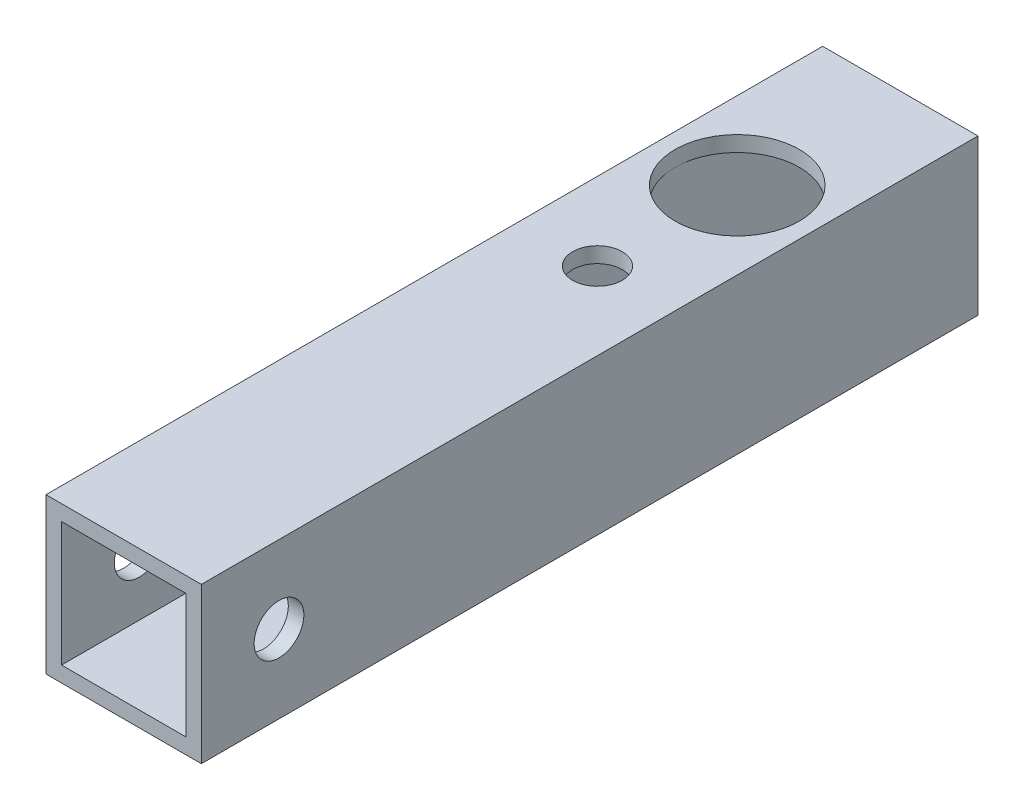
ISO-10303-21;
HEADER;
FILE_DESCRIPTION(('STEP AP214'),'2;1');
FILE_NAME('part.step','',(''),(''),'','','');
FILE_SCHEMA(('AUTOMOTIVE_DESIGN { 1 0 10303 214 1 1 1 1 }'));
ENDSEC;
DATA;
#1=APPLICATION_CONTEXT('core data for automotive mechanical design processes');
#2=APPLICATION_PROTOCOL_DEFINITION('international standard','automotive_design',2000,#1);
#3=PRODUCT_CONTEXT('',#1,'mechanical');
#4=PRODUCT('Part','Part','',(#3));
#5=PRODUCT_RELATED_PRODUCT_CATEGORY('part','',(#4));
#6=PRODUCT_DEFINITION_FORMATION('','',#4);
#7=PRODUCT_DEFINITION_CONTEXT('part definition',#1,'design');
#8=PRODUCT_DEFINITION('design','',#6,#7);
#9=PRODUCT_DEFINITION_SHAPE('','',#8);
#10=(LENGTH_UNIT() NAMED_UNIT(*) SI_UNIT(.MILLI.,.METRE.));
#11=(NAMED_UNIT(*) PLANE_ANGLE_UNIT() SI_UNIT($,.RADIAN.));
#12=(NAMED_UNIT(*) SI_UNIT($,.STERADIAN.) SOLID_ANGLE_UNIT());
#13=UNCERTAINTY_MEASURE_WITH_UNIT(LENGTH_MEASURE(1.E-05),#10,'distance_accuracy_value','');
#14=(GEOMETRIC_REPRESENTATION_CONTEXT(3) GLOBAL_UNCERTAINTY_ASSIGNED_CONTEXT((#13)) GLOBAL_UNIT_ASSIGNED_CONTEXT((#10,
#11,#12)) REPRESENTATION_CONTEXT('',''));
#15=CARTESIAN_POINT('',(0.,0.,0.));
#16=DIRECTION('',(0.,0.,1.));
#17=DIRECTION('',(1.,0.,0.));
#18=AXIS2_PLACEMENT_3D('',#15,#16,#17);
#19=CARTESIAN_POINT('',(0.,1.,50.));
#20=DIRECTION('',(0.,1.,0.));
#21=DIRECTION('',(0.,0.,1.));
#22=AXIS2_PLACEMENT_3D('',#19,#20,#21);
#23=PLANE('',#22);
#24=CARTESIAN_POINT('',(5.,1.,10.5));
#25=DIRECTION('',(0.,1.,0.));
#26=DIRECTION('',(0.,0.,1.));
#27=AXIS2_PLACEMENT_3D('',#24,#25,#26);
#28=CIRCLE('',#27,4.);
#29=CARTESIAN_POINT('',(9.,1.,10.5));
#30=VERTEX_POINT('',#29);
#31=CARTESIAN_POINT('',(1.,1.,10.5));
#32=VERTEX_POINT('',#31);
#33=EDGE_CURVE('E73',#30,#32,#28,.T.);
#34=ORIENTED_EDGE('',*,*,#33,.F.);
#35=DIRECTION('',(0.,0.,-1.));
#36=VECTOR('',#35,1.);
#37=CARTESIAN_POINT('',(9.,1.,50.));
#38=LINE('',#37,#36);
#39=CARTESIAN_POINT('',(9.,1.,0.));
#40=VERTEX_POINT('',#39);
#41=EDGE_CURVE('E160',#30,#40,#38,.T.);
#42=ORIENTED_EDGE('',*,*,#41,.T.);
#43=DIRECTION('',(1.,0.,0.));
#44=VECTOR('',#43,1.);
#45=CARTESIAN_POINT('',(0.,1.,0.));
#46=LINE('',#45,#44);
#47=CARTESIAN_POINT('',(1.,1.,0.));
#48=VERTEX_POINT('',#47);
#49=EDGE_CURVE('E233',#48,#40,#46,.T.);
#50=ORIENTED_EDGE('',*,*,#49,.F.);
#51=DIRECTION('',(0.,0.,-1.));
#52=VECTOR('',#51,1.);
#53=CARTESIAN_POINT('',(1.,1.,50.));
#54=LINE('',#53,#52);
#55=EDGE_CURVE('E167',#32,#48,#54,.T.);
#56=ORIENTED_EDGE('',*,*,#55,.F.);
#57=EDGE_LOOP('',(#34,#42,#50,#56));
#58=FACE_BOUND('',#57,.T.);
#59=ADVANCED_FACE('F58',(#58),#23,.T.);
#60=CARTESIAN_POINT('',(0.,9.,50.));
#61=DIRECTION('',(0.,-1.,0.));
#62=DIRECTION('',(0.,0.,-1.));
#63=AXIS2_PLACEMENT_3D('',#60,#61,#62);
#64=PLANE('',#63);
#65=CARTESIAN_POINT('',(5.,9.,10.5));
#66=DIRECTION('',(0.,-1.,0.));
#67=DIRECTION('',(0.,0.,-1.));
#68=AXIS2_PLACEMENT_3D('',#65,#66,#67);
#69=CIRCLE('',#68,4.);
#70=CARTESIAN_POINT('',(9.,9.,10.5));
#71=VERTEX_POINT('',#70);
#72=CARTESIAN_POINT('',(1.,9.,10.5));
#73=VERTEX_POINT('',#72);
#74=EDGE_CURVE('E12',#71,#73,#69,.T.);
#75=ORIENTED_EDGE('',*,*,#74,.F.);
#76=DIRECTION('',(0.,0.,-1.));
#77=VECTOR('',#76,1.);
#78=CARTESIAN_POINT('',(9.,9.,50.));
#79=LINE('',#78,#77);
#80=CARTESIAN_POINT('',(9.,9.,50.));
#81=VERTEX_POINT('',#80);
#82=EDGE_CURVE('E142',#81,#71,#79,.T.);
#83=ORIENTED_EDGE('',*,*,#82,.F.);
#84=DIRECTION('',(-1.,0.,0.));
#85=VECTOR('',#84,1.);
#86=CARTESIAN_POINT('',(0.,9.,50.));
#87=LINE('',#86,#85);
#88=CARTESIAN_POINT('',(1.,9.,50.));
#89=VERTEX_POINT('',#88);
#90=EDGE_CURVE('E227',#81,#89,#87,.T.);
#91=ORIENTED_EDGE('',*,*,#90,.T.);
#92=DIRECTION('',(0.,0.,-1.));
#93=VECTOR('',#92,1.);
#94=CARTESIAN_POINT('',(1.,9.,50.));
#95=LINE('',#94,#93);
#96=EDGE_CURVE('E145',#89,#73,#95,.T.);
#97=ORIENTED_EDGE('',*,*,#96,.T.);
#98=EDGE_LOOP('',(#75,#83,#91,#97));
#99=FACE_BOUND('',#98,.T.);
#100=CARTESIAN_POINT('',(5.,9.,19.5));
#101=DIRECTION('',(0.,-1.,0.));
#102=DIRECTION('',(0.,0.,-1.));
#103=AXIS2_PLACEMENT_3D('',#100,#101,#102);
#104=CIRCLE('',#103,1.6);
#105=CARTESIAN_POINT('',(5.,9.,17.9));
#106=VERTEX_POINT('',#105);
#107=EDGE_CURVE('E200',#106,#106,#104,.T.);
#108=ORIENTED_EDGE('',*,*,#107,.F.);
#109=EDGE_LOOP('',(#108));
#110=FACE_BOUND('',#109,.T.);
#111=ADVANCED_FACE('F139',(#99,#110),#64,.T.);
#112=CARTESIAN_POINT('',(0.,0.,50.));
#113=DIRECTION('',(0.,0.,1.));
#114=DIRECTION('',(1.,0.,0.));
#115=AXIS2_PLACEMENT_3D('',#112,#113,#114);
#116=PLANE('',#115);
#117=DIRECTION('',(0.,-1.,0.));
#118=VECTOR('',#117,1.);
#119=CARTESIAN_POINT('',(0.,0.,50.));
#120=LINE('',#119,#118);
#121=CARTESIAN_POINT('',(0.,10.,50.));
#122=VERTEX_POINT('',#121);
#123=CARTESIAN_POINT('',(0.,0.,50.));
#124=VERTEX_POINT('',#123);
#125=EDGE_CURVE('E172',#122,#124,#120,.T.);
#126=ORIENTED_EDGE('',*,*,#125,.T.);
#127=DIRECTION('',(1.,0.,0.));
#128=VECTOR('',#127,1.);
#129=CARTESIAN_POINT('',(0.,0.,50.));
#130=LINE('',#129,#128);
#131=CARTESIAN_POINT('',(10.,0.,50.));
#132=VERTEX_POINT('',#131);
#133=EDGE_CURVE('E175',#124,#132,#130,.T.);
#134=ORIENTED_EDGE('',*,*,#133,.T.);
#135=DIRECTION('',(0.,1.,0.));
#136=VECTOR('',#135,1.);
#137=CARTESIAN_POINT('',(10.,0.,50.));
#138=LINE('',#137,#136);
#139=CARTESIAN_POINT('',(10.,10.,50.));
#140=VERTEX_POINT('',#139);
#141=EDGE_CURVE('E178',#132,#140,#138,.T.);
#142=ORIENTED_EDGE('',*,*,#141,.T.);
#143=DIRECTION('',(-1.,0.,0.));
#144=VECTOR('',#143,1.);
#145=CARTESIAN_POINT('',(0.,10.,50.));
#146=LINE('',#145,#144);
#147=EDGE_CURVE('E180',#140,#122,#146,.T.);
#148=ORIENTED_EDGE('',*,*,#147,.T.);
#149=EDGE_LOOP('',(#126,#134,#142,#148));
#150=FACE_BOUND('',#149,.T.);
#151=DIRECTION('',(1.,0.,0.));
#152=VECTOR('',#151,1.);
#153=CARTESIAN_POINT('',(0.,1.,50.));
#154=LINE('',#153,#152);
#155=CARTESIAN_POINT('',(1.,1.,50.));
#156=VERTEX_POINT('',#155);
#157=CARTESIAN_POINT('',(9.,1.,50.));
#158=VERTEX_POINT('',#157);
#159=EDGE_CURVE('E224',#156,#158,#154,.T.);
#160=ORIENTED_EDGE('',*,*,#159,.F.);
#161=DIRECTION('',(0.,-1.,0.));
#162=VECTOR('',#161,1.);
#163=CARTESIAN_POINT('',(1.,0.,50.));
#164=LINE('',#163,#162);
#165=EDGE_CURVE('E222',#89,#156,#164,.T.);
#166=ORIENTED_EDGE('',*,*,#165,.F.);
#167=ORIENTED_EDGE('',*,*,#90,.F.);
#168=DIRECTION('',(0.,1.,0.));
#169=VECTOR('',#168,1.);
#170=CARTESIAN_POINT('',(9.,0.,50.));
#171=LINE('',#170,#169);
#172=EDGE_CURVE('E158',#158,#81,#171,.T.);
#173=ORIENTED_EDGE('',*,*,#172,.F.);
#174=EDGE_LOOP('',(#160,#166,#167,#173));
#175=FACE_BOUND('',#174,.T.);
#176=ADVANCED_FACE('F250',(#150,#175),#116,.T.);
#177=CARTESIAN_POINT('',(0.,0.,0.));
#178=DIRECTION('',(0.,0.,1.));
#179=DIRECTION('',(1.,0.,0.));
#180=AXIS2_PLACEMENT_3D('',#177,#178,#179);
#181=PLANE('',#180);
#182=DIRECTION('',(0.,-1.,0.));
#183=VECTOR('',#182,1.);
#184=CARTESIAN_POINT('',(0.,0.,0.));
#185=LINE('',#184,#183);
#186=CARTESIAN_POINT('',(0.,10.,0.));
#187=VERTEX_POINT('',#186);
#188=CARTESIAN_POINT('',(0.,0.,0.));
#189=VERTEX_POINT('',#188);
#190=EDGE_CURVE('E171',#187,#189,#185,.T.);
#191=ORIENTED_EDGE('',*,*,#190,.F.);
#192=DIRECTION('',(-1.,0.,0.));
#193=VECTOR('',#192,1.);
#194=CARTESIAN_POINT('',(0.,10.,0.));
#195=LINE('',#194,#193);
#196=CARTESIAN_POINT('',(10.,10.,0.));
#197=VERTEX_POINT('',#196);
#198=EDGE_CURVE('E176',#197,#187,#195,.T.);
#199=ORIENTED_EDGE('',*,*,#198,.F.);
#200=DIRECTION('',(0.,1.,0.));
#201=VECTOR('',#200,1.);
#202=CARTESIAN_POINT('',(10.,0.,0.));
#203=LINE('',#202,#201);
#204=CARTESIAN_POINT('',(10.,0.,0.));
#205=VERTEX_POINT('',#204);
#206=EDGE_CURVE('E187',#205,#197,#203,.T.);
#207=ORIENTED_EDGE('',*,*,#206,.F.);
#208=DIRECTION('',(1.,0.,0.));
#209=VECTOR('',#208,1.);
#210=CARTESIAN_POINT('',(0.,0.,0.));
#211=LINE('',#210,#209);
#212=EDGE_CURVE('E185',#189,#205,#211,.T.);
#213=ORIENTED_EDGE('',*,*,#212,.F.);
#214=EDGE_LOOP('',(#191,#199,#207,#213));
#215=FACE_BOUND('',#214,.T.);
#216=DIRECTION('',(0.,-1.,0.));
#217=VECTOR('',#216,1.);
#218=CARTESIAN_POINT('',(1.,0.,0.));
#219=LINE('',#218,#217);
#220=CARTESIAN_POINT('',(1.,9.,0.));
#221=VERTEX_POINT('',#220);
#222=EDGE_CURVE('E230',#221,#48,#219,.T.);
#223=ORIENTED_EDGE('',*,*,#222,.T.);
#224=ORIENTED_EDGE('',*,*,#49,.T.);
#225=DIRECTION('',(0.,1.,0.));
#226=VECTOR('',#225,1.);
#227=CARTESIAN_POINT('',(9.,0.,0.));
#228=LINE('',#227,#226);
#229=CARTESIAN_POINT('',(9.,9.,0.));
#230=VERTEX_POINT('',#229);
#231=EDGE_CURVE('E236',#40,#230,#228,.T.);
#232=ORIENTED_EDGE('',*,*,#231,.T.);
#233=DIRECTION('',(-1.,0.,0.));
#234=VECTOR('',#233,1.);
#235=CARTESIAN_POINT('',(0.,9.,0.));
#236=LINE('',#235,#234);
#237=EDGE_CURVE('E150',#230,#221,#236,.T.);
#238=ORIENTED_EDGE('',*,*,#237,.T.);
#239=EDGE_LOOP('',(#223,#224,#232,#238));
#240=FACE_BOUND('',#239,.T.);
#241=ADVANCED_FACE('F238',(#215,#240),#181,.F.);
#242=CARTESIAN_POINT('',(0.,0.,50.));
#243=DIRECTION('',(1.,0.,0.));
#244=DIRECTION('',(0.,0.,-1.));
#245=AXIS2_PLACEMENT_3D('',#242,#243,#244);
#246=PLANE('',#245);
#247=CARTESIAN_POINT('',(0.,5.,45.));
#248=DIRECTION('',(1.,0.,0.));
#249=DIRECTION('',(0.,1.,0.));
#250=AXIS2_PLACEMENT_3D('',#247,#248,#249);
#251=CIRCLE('',#250,1.6);
#252=CARTESIAN_POINT('',(0.,6.6,45.));
#253=VERTEX_POINT('',#252);
#254=EDGE_CURVE('E280',#253,#253,#251,.T.);
#255=ORIENTED_EDGE('',*,*,#254,.T.);
#256=EDGE_LOOP('',(#255));
#257=FACE_BOUND('',#256,.T.);
#258=ORIENTED_EDGE('',*,*,#190,.T.);
#259=DIRECTION('',(0.,0.,-1.));
#260=VECTOR('',#259,1.);
#261=CARTESIAN_POINT('',(0.,0.,50.));
#262=LINE('',#261,#260);
#263=EDGE_CURVE('E136',#124,#189,#262,.T.);
#264=ORIENTED_EDGE('',*,*,#263,.F.);
#265=ORIENTED_EDGE('',*,*,#125,.F.);
#266=DIRECTION('',(0.,0.,-1.));
#267=VECTOR('',#266,1.);
#268=CARTESIAN_POINT('',(0.,10.,50.));
#269=LINE('',#268,#267);
#270=EDGE_CURVE('E182',#122,#187,#269,.T.);
#271=ORIENTED_EDGE('',*,*,#270,.T.);
#272=EDGE_LOOP('',(#258,#264,#265,#271));
#273=FACE_BOUND('',#272,.T.);
#274=ADVANCED_FACE('F60',(#257,#273),#246,.F.);
#275=CARTESIAN_POINT('',(0.,0.,50.));
#276=DIRECTION('',(0.,1.,0.));
#277=DIRECTION('',(0.,0.,1.));
#278=AXIS2_PLACEMENT_3D('',#275,#276,#277);
#279=PLANE('',#278);
#280=CARTESIAN_POINT('',(5.,0.,19.5));
#281=DIRECTION('',(0.,-1.,0.));
#282=DIRECTION('',(0.,0.,-1.));
#283=AXIS2_PLACEMENT_3D('',#280,#281,#282);
#284=CIRCLE('',#283,2.6);
#285=CARTESIAN_POINT('',(5.,0.,16.9));
#286=VERTEX_POINT('',#285);
#287=EDGE_CURVE('E220',#286,#286,#284,.T.);
#288=ORIENTED_EDGE('',*,*,#287,.F.);
#289=EDGE_LOOP('',(#288));
#290=FACE_BOUND('',#289,.T.);
#291=CARTESIAN_POINT('',(5.,0.,10.5));
#292=DIRECTION('',(0.,1.,0.));
#293=DIRECTION('',(0.,0.,1.));
#294=AXIS2_PLACEMENT_3D('',#291,#292,#293);
#295=CIRCLE('',#294,4.);
#296=CARTESIAN_POINT('',(5.,0.,14.5));
#297=VERTEX_POINT('',#296);
#298=EDGE_CURVE('E203',#297,#297,#295,.T.);
#299=ORIENTED_EDGE('',*,*,#298,.T.);
#300=EDGE_LOOP('',(#299));
#301=FACE_BOUND('',#300,.T.);
#302=ORIENTED_EDGE('',*,*,#212,.T.);
#303=DIRECTION('',(0.,0.,-1.));
#304=VECTOR('',#303,1.);
#305=CARTESIAN_POINT('',(10.,0.,50.));
#306=LINE('',#305,#304);
#307=EDGE_CURVE('E195',#132,#205,#306,.T.);
#308=ORIENTED_EDGE('',*,*,#307,.F.);
#309=ORIENTED_EDGE('',*,*,#133,.F.);
#310=ORIENTED_EDGE('',*,*,#263,.T.);
#311=EDGE_LOOP('',(#302,#308,#309,#310));
#312=FACE_BOUND('',#311,.T.);
#313=ADVANCED_FACE('F362',(#290,#301,#312),#279,.F.);
#314=CARTESIAN_POINT('',(10.,0.,50.));
#315=DIRECTION('',(-1.,0.,0.));
#316=DIRECTION('',(0.,-1.,0.));
#317=AXIS2_PLACEMENT_3D('',#314,#315,#316);
#318=PLANE('',#317);
#319=CARTESIAN_POINT('',(10.,5.,45.));
#320=DIRECTION('',(1.,0.,0.));
#321=DIRECTION('',(0.,1.,0.));
#322=AXIS2_PLACEMENT_3D('',#319,#320,#321);
#323=CIRCLE('',#322,1.6);
#324=CARTESIAN_POINT('',(10.,6.6,45.));
#325=VERTEX_POINT('',#324);
#326=EDGE_CURVE('E282',#325,#325,#323,.T.);
#327=ORIENTED_EDGE('',*,*,#326,.F.);
#328=EDGE_LOOP('',(#327));
#329=FACE_BOUND('',#328,.T.);
#330=ORIENTED_EDGE('',*,*,#206,.T.);
#331=DIRECTION('',(0.,0.,-1.));
#332=VECTOR('',#331,1.);
#333=CARTESIAN_POINT('',(10.,10.,50.));
#334=LINE('',#333,#332);
#335=EDGE_CURVE('E192',#140,#197,#334,.T.);
#336=ORIENTED_EDGE('',*,*,#335,.F.);
#337=ORIENTED_EDGE('',*,*,#141,.F.);
#338=ORIENTED_EDGE('',*,*,#307,.T.);
#339=EDGE_LOOP('',(#330,#336,#337,#338));
#340=FACE_BOUND('',#339,.T.);
#341=ADVANCED_FACE('F358',(#329,#340),#318,.F.);
#342=CARTESIAN_POINT('',(0.,10.,50.));
#343=DIRECTION('',(0.,-1.,0.));
#344=DIRECTION('',(0.,0.,-1.));
#345=AXIS2_PLACEMENT_3D('',#342,#343,#344);
#346=PLANE('',#345);
#347=CARTESIAN_POINT('',(5.,10.,10.5));
#348=DIRECTION('',(0.,1.,0.));
#349=DIRECTION('',(0.,0.,1.));
#350=AXIS2_PLACEMENT_3D('',#347,#348,#349);
#351=CIRCLE('',#350,4.);
#352=CARTESIAN_POINT('',(5.,10.,14.5));
#353=VERTEX_POINT('',#352);
#354=EDGE_CURVE('E208',#353,#353,#351,.T.);
#355=ORIENTED_EDGE('',*,*,#354,.F.);
#356=EDGE_LOOP('',(#355));
#357=FACE_BOUND('',#356,.T.);
#358=CARTESIAN_POINT('',(5.,10.,19.5));
#359=DIRECTION('',(0.,1.,0.));
#360=DIRECTION('',(0.,0.,1.));
#361=AXIS2_PLACEMENT_3D('',#358,#359,#360);
#362=CIRCLE('',#361,1.6);
#363=CARTESIAN_POINT('',(5.,10.,21.1));
#364=VERTEX_POINT('',#363);
#365=EDGE_CURVE('E213',#364,#364,#362,.T.);
#366=ORIENTED_EDGE('',*,*,#365,.F.);
#367=EDGE_LOOP('',(#366));
#368=FACE_BOUND('',#367,.T.);
#369=ORIENTED_EDGE('',*,*,#198,.T.);
#370=ORIENTED_EDGE('',*,*,#270,.F.);
#371=ORIENTED_EDGE('',*,*,#147,.F.);
#372=ORIENTED_EDGE('',*,*,#335,.T.);
#373=EDGE_LOOP('',(#369,#370,#371,#372));
#374=FACE_BOUND('',#373,.T.);
#375=ADVANCED_FACE('F268',(#357,#368,#374),#346,.F.);
#376=CARTESIAN_POINT('',(1.,0.,50.));
#377=DIRECTION('',(1.,0.,0.));
#378=DIRECTION('',(0.,0.,-1.));
#379=AXIS2_PLACEMENT_3D('',#376,#377,#378);
#380=PLANE('',#379);
#381=CARTESIAN_POINT('',(1.,5.,45.));
#382=DIRECTION('',(1.,0.,0.));
#383=DIRECTION('',(0.,0.,-1.));
#384=AXIS2_PLACEMENT_3D('',#381,#382,#383);
#385=CIRCLE('',#384,1.6);
#386=CARTESIAN_POINT('',(1.,5.,43.4));
#387=VERTEX_POINT('',#386);
#388=EDGE_CURVE('E273',#387,#387,#385,.T.);
#389=ORIENTED_EDGE('',*,*,#388,.F.);
#390=EDGE_LOOP('',(#389));
#391=FACE_BOUND('',#390,.T.);
#392=EDGE_CURVE('E229',#73,#221,#95,.T.);
#393=ORIENTED_EDGE('',*,*,#392,.F.);
#394=ORIENTED_EDGE('',*,*,#96,.F.);
#395=ORIENTED_EDGE('',*,*,#165,.T.);
#396=EDGE_CURVE('E168',#156,#32,#54,.T.);
#397=ORIENTED_EDGE('',*,*,#396,.T.);
#398=ORIENTED_EDGE('',*,*,#55,.T.);
#399=ORIENTED_EDGE('',*,*,#222,.F.);
#400=EDGE_LOOP('',(#393,#394,#395,#397,#398,#399));
#401=FACE_BOUND('',#400,.T.);
#402=ADVANCED_FACE('F252',(#391,#401),#380,.T.);
#403=CARTESIAN_POINT('',(5.,1.,19.5));
#404=DIRECTION('',(0.,1.,0.));
#405=DIRECTION('',(0.,0.,1.));
#406=AXIS2_PLACEMENT_3D('',#403,#404,#405);
#407=CIRCLE('',#406,2.6);
#408=CARTESIAN_POINT('',(5.,1.,22.1));
#409=VERTEX_POINT('',#408);
#410=EDGE_CURVE('E216',#409,#409,#407,.F.);
#411=ORIENTED_EDGE('',*,*,#410,.T.);
#412=EDGE_LOOP('',(#411));
#413=FACE_BOUND('',#412,.T.);
#414=EDGE_CURVE('E202',#32,#30,#28,.T.);
#415=ORIENTED_EDGE('',*,*,#414,.F.);
#416=ORIENTED_EDGE('',*,*,#396,.F.);
#417=ORIENTED_EDGE('',*,*,#159,.T.);
#418=EDGE_CURVE('E161',#158,#30,#38,.T.);
#419=ORIENTED_EDGE('',*,*,#418,.T.);
#420=EDGE_LOOP('',(#415,#416,#417,#419));
#421=FACE_BOUND('',#420,.T.);
#422=ADVANCED_FACE('F244',(#413,#421),#23,.T.);
#423=CARTESIAN_POINT('',(9.,0.,50.));
#424=DIRECTION('',(-1.,0.,0.));
#425=DIRECTION('',(0.,-1.,0.));
#426=AXIS2_PLACEMENT_3D('',#423,#424,#425);
#427=PLANE('',#426);
#428=CARTESIAN_POINT('',(9.,5.,45.));
#429=DIRECTION('',(-1.,0.,0.));
#430=DIRECTION('',(0.,-1.,0.));
#431=AXIS2_PLACEMENT_3D('',#428,#429,#430);
#432=CIRCLE('',#431,1.6);
#433=CARTESIAN_POINT('',(9.,3.4,45.));
#434=VERTEX_POINT('',#433);
#435=EDGE_CURVE('E62',#434,#434,#432,.T.);
#436=ORIENTED_EDGE('',*,*,#435,.F.);
#437=EDGE_LOOP('',(#436));
#438=FACE_BOUND('',#437,.T.);
#439=ORIENTED_EDGE('',*,*,#82,.T.);
#440=EDGE_CURVE('E147',#71,#230,#79,.T.);
#441=ORIENTED_EDGE('',*,*,#440,.T.);
#442=ORIENTED_EDGE('',*,*,#231,.F.);
#443=ORIENTED_EDGE('',*,*,#41,.F.);
#444=ORIENTED_EDGE('',*,*,#418,.F.);
#445=ORIENTED_EDGE('',*,*,#172,.T.);
#446=EDGE_LOOP('',(#439,#441,#442,#443,#444,#445));
#447=FACE_BOUND('',#446,.T.);
#448=ADVANCED_FACE('F155',(#438,#447),#427,.T.);
#449=EDGE_CURVE('E67',#73,#71,#69,.T.);
#450=ORIENTED_EDGE('',*,*,#449,.F.);
#451=ORIENTED_EDGE('',*,*,#392,.T.);
#452=ORIENTED_EDGE('',*,*,#237,.F.);
#453=ORIENTED_EDGE('',*,*,#440,.F.);
#454=EDGE_LOOP('',(#450,#451,#452,#453));
#455=FACE_BOUND('',#454,.T.);
#456=ADVANCED_FACE('F148',(#455),#64,.T.);
#457=CARTESIAN_POINT('',(5.,0.,19.5));
#458=DIRECTION('',(0.,1.,0.));
#459=DIRECTION('',(0.,0.,1.));
#460=AXIS2_PLACEMENT_3D('',#457,#458,#459);
#461=CYLINDRICAL_SURFACE('',#460,1.6);
#462=ORIENTED_EDGE('',*,*,#107,.T.);
#463=EDGE_LOOP('',(#462));
#464=FACE_BOUND('',#463,.T.);
#465=ORIENTED_EDGE('',*,*,#365,.T.);
#466=EDGE_LOOP('',(#465));
#467=FACE_BOUND('',#466,.T.);
#468=ADVANCED_FACE('F305',(#464,#467),#461,.F.);
#469=CARTESIAN_POINT('',(5.,0.,10.5));
#470=DIRECTION('',(0.,1.,0.));
#471=DIRECTION('',(0.,0.,1.));
#472=AXIS2_PLACEMENT_3D('',#469,#470,#471);
#473=CYLINDRICAL_SURFACE('',#472,4.);
#474=ORIENTED_EDGE('',*,*,#74,.T.);
#475=ORIENTED_EDGE('',*,*,#449,.T.);
#476=EDGE_LOOP('',(#474,#475));
#477=FACE_BOUND('',#476,.T.);
#478=ORIENTED_EDGE('',*,*,#354,.T.);
#479=EDGE_LOOP('',(#478));
#480=FACE_BOUND('',#479,.T.);
#481=ADVANCED_FACE('F131',(#477,#480),#473,.F.);
#482=ORIENTED_EDGE('',*,*,#33,.T.);
#483=ORIENTED_EDGE('',*,*,#414,.T.);
#484=EDGE_LOOP('',(#482,#483));
#485=FACE_BOUND('',#484,.T.);
#486=ORIENTED_EDGE('',*,*,#298,.F.);
#487=EDGE_LOOP('',(#486));
#488=FACE_BOUND('',#487,.T.);
#489=ADVANCED_FACE('F302',(#485,#488),#473,.F.);
#490=CARTESIAN_POINT('',(5.,10.001,19.5));
#491=DIRECTION('',(0.,-1.,0.));
#492=DIRECTION('',(0.,0.,-1.));
#493=AXIS2_PLACEMENT_3D('',#490,#491,#492);
#494=CYLINDRICAL_SURFACE('',#493,2.6);
#495=ORIENTED_EDGE('',*,*,#410,.F.);
#496=EDGE_LOOP('',(#495));
#497=FACE_BOUND('',#496,.T.);
#498=ORIENTED_EDGE('',*,*,#287,.T.);
#499=EDGE_LOOP('',(#498));
#500=FACE_BOUND('',#499,.T.);
#501=ADVANCED_FACE('F297',(#497,#500),#494,.F.);
#502=CARTESIAN_POINT('',(0.,5.,45.));
#503=DIRECTION('',(1.,0.,0.));
#504=DIRECTION('',(0.,1.,0.));
#505=AXIS2_PLACEMENT_3D('',#502,#503,#504);
#506=CYLINDRICAL_SURFACE('',#505,1.6);
#507=ORIENTED_EDGE('',*,*,#435,.T.);
#508=EDGE_LOOP('',(#507));
#509=FACE_BOUND('',#508,.T.);
#510=ORIENTED_EDGE('',*,*,#326,.T.);
#511=EDGE_LOOP('',(#510));
#512=FACE_BOUND('',#511,.T.);
#513=ADVANCED_FACE('F292',(#509,#512),#506,.F.);
#514=ORIENTED_EDGE('',*,*,#388,.T.);
#515=EDGE_LOOP('',(#514));
#516=FACE_BOUND('',#515,.T.);
#517=ORIENTED_EDGE('',*,*,#254,.F.);
#518=EDGE_LOOP('',(#517));
#519=FACE_BOUND('',#518,.T.);
#520=ADVANCED_FACE('F290',(#516,#519),#506,.F.);
#521=CLOSED_SHELL('',(#59,#111,#176,#241,#274,#313,#341,#375,#402,#422,#448,#456,#468,#481,#489,
#501,#513,#520));
#522=MANIFOLD_SOLID_BREP('B2',#521);
#523=ADVANCED_BREP_SHAPE_REPRESENTATION('',(#18,#522),#14);
#524=SHAPE_DEFINITION_REPRESENTATION(#9,#523);
ENDSEC;
END-ISO-10303-21;
